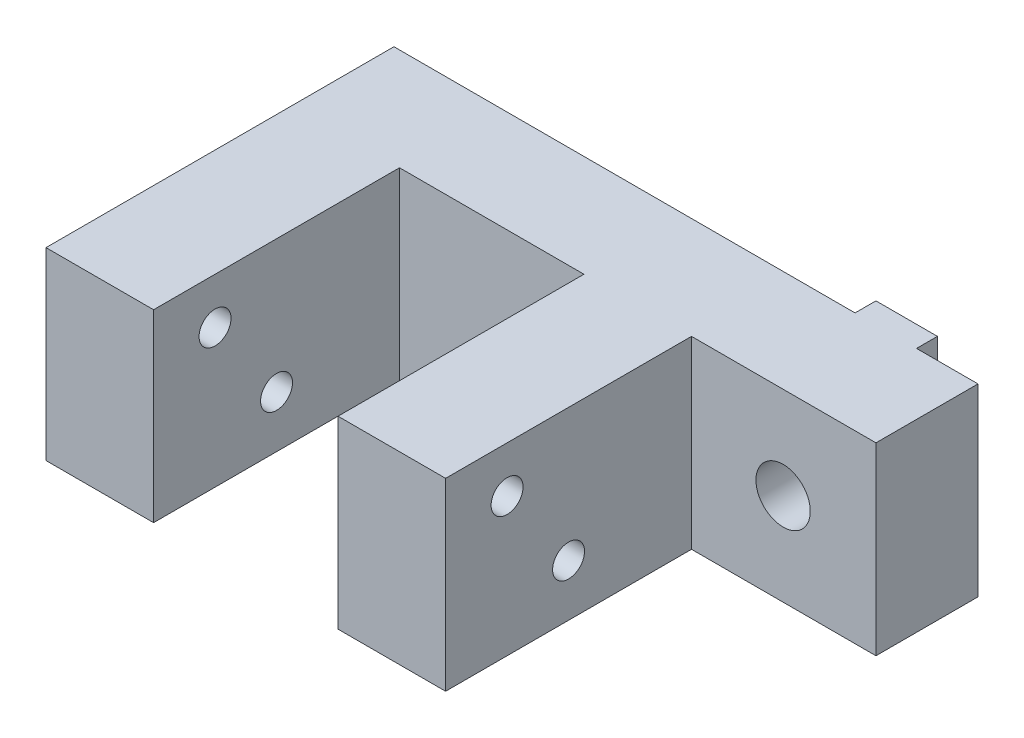
ISO-10303-21;
HEADER;
FILE_DESCRIPTION(('STEP AP214'),'2;1');
FILE_NAME('part.step','',(''),(''),'','','');
FILE_SCHEMA(('AUTOMOTIVE_DESIGN { 1 0 10303 214 1 1 1 1 }'));
ENDSEC;
DATA;
#1=APPLICATION_CONTEXT('core data for automotive mechanical design processes');
#2=APPLICATION_PROTOCOL_DEFINITION('international standard','automotive_design',2000,#1);
#3=PRODUCT_CONTEXT('',#1,'mechanical');
#4=PRODUCT('Part','Part','',(#3));
#5=PRODUCT_RELATED_PRODUCT_CATEGORY('part','',(#4));
#6=PRODUCT_DEFINITION_FORMATION('','',#4);
#7=PRODUCT_DEFINITION_CONTEXT('part definition',#1,'design');
#8=PRODUCT_DEFINITION('design','',#6,#7);
#9=PRODUCT_DEFINITION_SHAPE('','',#8);
#10=(LENGTH_UNIT() NAMED_UNIT(*) SI_UNIT(.MILLI.,.METRE.));
#11=(NAMED_UNIT(*) PLANE_ANGLE_UNIT() SI_UNIT($,.RADIAN.));
#12=(NAMED_UNIT(*) SI_UNIT($,.STERADIAN.) SOLID_ANGLE_UNIT());
#13=UNCERTAINTY_MEASURE_WITH_UNIT(LENGTH_MEASURE(1.E-05),#10,'distance_accuracy_value','');
#14=(GEOMETRIC_REPRESENTATION_CONTEXT(3) GLOBAL_UNCERTAINTY_ASSIGNED_CONTEXT((#13)) GLOBAL_UNIT_ASSIGNED_CONTEXT((#10,
#11,#12)) REPRESENTATION_CONTEXT('',''));
#15=CARTESIAN_POINT('',(0.,0.,0.));
#16=DIRECTION('',(0.,0.,1.));
#17=DIRECTION('',(1.,0.,0.));
#18=AXIS2_PLACEMENT_3D('',#15,#16,#17);
#19=CARTESIAN_POINT('',(41.275,9.525,12.7));
#20=DIRECTION('',(0.,0.,-1.));
#21=DIRECTION('',(-1.,0.,0.));
#22=AXIS2_PLACEMENT_3D('',#19,#20,#21);
#23=PLANE('',#22);
#24=CARTESIAN_POINT('',(50.7365,0.,12.7));
#25=DIRECTION('',(0.,0.,-1.));
#26=DIRECTION('',(-1.,0.,0.));
#27=AXIS2_PLACEMENT_3D('',#24,#25,#26);
#28=CIRCLE('',#27,2.80669999999999);
#29=CARTESIAN_POINT('',(47.9298,0.,12.7));
#30=VERTEX_POINT('',#29);
#31=EDGE_CURVE('E312',#30,#30,#28,.T.);
#32=ORIENTED_EDGE('',*,*,#31,.T.);
#33=EDGE_LOOP('',(#32));
#34=FACE_BOUND('',#33,.T.);
#35=DIRECTION('',(1.,0.,0.));
#36=VECTOR('',#35,1.);
#37=CARTESIAN_POINT('',(41.275,-9.525,12.7));
#38=LINE('',#37,#36);
#39=CARTESIAN_POINT('',(41.275,-9.525,12.7));
#40=VERTEX_POINT('',#39);
#41=CARTESIAN_POINT('',(60.325,-9.525,12.7));
#42=VERTEX_POINT('',#41);
#43=EDGE_CURVE('E138',#40,#42,#38,.T.);
#44=ORIENTED_EDGE('',*,*,#43,.T.);
#45=DIRECTION('',(0.,-1.,0.));
#46=VECTOR('',#45,1.);
#47=CARTESIAN_POINT('',(60.325,9.525,12.7));
#48=LINE('',#47,#46);
#49=CARTESIAN_POINT('',(60.325,9.525,12.7));
#50=VERTEX_POINT('',#49);
#51=EDGE_CURVE('E11',#50,#42,#48,.T.);
#52=ORIENTED_EDGE('',*,*,#51,.F.);
#53=DIRECTION('',(1.,0.,0.));
#54=VECTOR('',#53,1.);
#55=CARTESIAN_POINT('',(41.275,9.525,12.7));
#56=LINE('',#55,#54);
#57=CARTESIAN_POINT('',(41.275,9.525,12.7));
#58=VERTEX_POINT('',#57);
#59=EDGE_CURVE('E182',#58,#50,#56,.T.);
#60=ORIENTED_EDGE('',*,*,#59,.F.);
#61=DIRECTION('',(0.,-1.,0.));
#62=VECTOR('',#61,1.);
#63=CARTESIAN_POINT('',(41.275,9.525,12.7));
#64=LINE('',#63,#62);
#65=EDGE_CURVE('E151',#58,#40,#64,.T.);
#66=ORIENTED_EDGE('',*,*,#65,.T.);
#67=EDGE_LOOP('',(#44,#52,#60,#66));
#68=FACE_BOUND('',#67,.T.);
#69=ADVANCED_FACE('F34',(#34,#68),#23,.F.);
#70=CARTESIAN_POINT('',(60.325,9.525,12.7));
#71=DIRECTION('',(-1.,0.,0.));
#72=DIRECTION('',(0.,0.,1.));
#73=AXIS2_PLACEMENT_3D('',#70,#71,#72);
#74=PLANE('',#73);
#75=DIRECTION('',(0.,0.,-1.));
#76=VECTOR('',#75,1.);
#77=CARTESIAN_POINT('',(60.325,-9.525,12.7));
#78=LINE('',#77,#76);
#79=CARTESIAN_POINT('',(60.325,-9.525,2.159));
#80=VERTEX_POINT('',#79);
#81=EDGE_CURVE('E134',#42,#80,#78,.T.);
#82=ORIENTED_EDGE('',*,*,#81,.T.);
#83=DIRECTION('',(0.,-1.,0.));
#84=VECTOR('',#83,1.);
#85=CARTESIAN_POINT('',(60.325,9.525,2.159));
#86=LINE('',#85,#84);
#87=CARTESIAN_POINT('',(60.325,9.525,2.159));
#88=VERTEX_POINT('',#87);
#89=EDGE_CURVE('E41',#88,#80,#86,.T.);
#90=ORIENTED_EDGE('',*,*,#89,.F.);
#91=DIRECTION('',(0.,0.,-1.));
#92=VECTOR('',#91,1.);
#93=CARTESIAN_POINT('',(60.325,9.525,12.7));
#94=LINE('',#93,#92);
#95=EDGE_CURVE('E147',#50,#88,#94,.T.);
#96=ORIENTED_EDGE('',*,*,#95,.F.);
#97=ORIENTED_EDGE('',*,*,#51,.T.);
#98=EDGE_LOOP('',(#82,#90,#96,#97));
#99=FACE_BOUND('',#98,.T.);
#100=ADVANCED_FACE('F146',(#99),#74,.F.);
#101=CARTESIAN_POINT('',(53.975,9.525,2.159));
#102=DIRECTION('',(0.,0.,1.));
#103=DIRECTION('',(1.,0.,0.));
#104=AXIS2_PLACEMENT_3D('',#101,#102,#103);
#105=PLANE('',#104);
#106=DIRECTION('',(-1.,0.,0.));
#107=VECTOR('',#106,1.);
#108=CARTESIAN_POINT('',(53.975,-9.525,2.159));
#109=LINE('',#108,#107);
#110=CARTESIAN_POINT('',(53.975,-9.525,2.159));
#111=VERTEX_POINT('',#110);
#112=EDGE_CURVE('E140',#80,#111,#109,.T.);
#113=ORIENTED_EDGE('',*,*,#112,.T.);
#114=DIRECTION('',(0.,-1.,0.));
#115=VECTOR('',#114,1.);
#116=CARTESIAN_POINT('',(53.975,9.525,2.159));
#117=LINE('',#116,#115);
#118=CARTESIAN_POINT('',(53.975,9.525,2.159));
#119=VERTEX_POINT('',#118);
#120=EDGE_CURVE('E238',#119,#111,#117,.T.);
#121=ORIENTED_EDGE('',*,*,#120,.F.);
#122=DIRECTION('',(-1.,0.,0.));
#123=VECTOR('',#122,1.);
#124=CARTESIAN_POINT('',(53.975,9.525,2.159));
#125=LINE('',#124,#123);
#126=EDGE_CURVE('E185',#88,#119,#125,.T.);
#127=ORIENTED_EDGE('',*,*,#126,.F.);
#128=ORIENTED_EDGE('',*,*,#89,.T.);
#129=EDGE_LOOP('',(#113,#121,#127,#128));
#130=FACE_BOUND('',#129,.T.);
#131=ADVANCED_FACE('F242',(#130),#105,.F.);
#132=CARTESIAN_POINT('',(53.975,9.525,0.));
#133=DIRECTION('',(-1.,0.,0.));
#134=DIRECTION('',(0.,0.,1.));
#135=AXIS2_PLACEMENT_3D('',#132,#133,#134);
#136=PLANE('',#135);
#137=DIRECTION('',(0.,0.,-1.));
#138=VECTOR('',#137,1.);
#139=CARTESIAN_POINT('',(53.975,-9.525,0.));
#140=LINE('',#139,#138);
#141=CARTESIAN_POINT('',(53.975,-9.525,0.));
#142=VERTEX_POINT('',#141);
#143=EDGE_CURVE('E160',#111,#142,#140,.T.);
#144=ORIENTED_EDGE('',*,*,#143,.T.);
#145=DIRECTION('',(0.,-1.,0.));
#146=VECTOR('',#145,1.);
#147=CARTESIAN_POINT('',(53.975,9.525,0.));
#148=LINE('',#147,#146);
#149=CARTESIAN_POINT('',(53.975,9.525,0.));
#150=VERTEX_POINT('',#149);
#151=EDGE_CURVE('E235',#150,#142,#148,.T.);
#152=ORIENTED_EDGE('',*,*,#151,.F.);
#153=DIRECTION('',(0.,0.,-1.));
#154=VECTOR('',#153,1.);
#155=CARTESIAN_POINT('',(53.975,9.525,0.));
#156=LINE('',#155,#154);
#157=EDGE_CURVE('E187',#119,#150,#156,.T.);
#158=ORIENTED_EDGE('',*,*,#157,.F.);
#159=ORIENTED_EDGE('',*,*,#120,.T.);
#160=EDGE_LOOP('',(#144,#152,#158,#159));
#161=FACE_BOUND('',#160,.T.);
#162=ADVANCED_FACE('F250',(#161),#136,.F.);
#163=CARTESIAN_POINT('',(47.625,9.525,0.));
#164=DIRECTION('',(0.,0.,1.));
#165=DIRECTION('',(1.,0.,0.));
#166=AXIS2_PLACEMENT_3D('',#163,#164,#165);
#167=PLANE('',#166);
#168=CARTESIAN_POINT('',(50.7365,0.,0.));
#169=DIRECTION('',(0.,0.,-1.));
#170=DIRECTION('',(-1.,0.,0.));
#171=AXIS2_PLACEMENT_3D('',#168,#169,#170);
#172=CIRCLE('',#171,2.80669999999999);
#173=CARTESIAN_POINT('',(47.9298,0.,0.));
#174=VERTEX_POINT('',#173);
#175=EDGE_CURVE('E315',#174,#174,#172,.T.);
#176=ORIENTED_EDGE('',*,*,#175,.F.);
#177=EDGE_LOOP('',(#176));
#178=FACE_BOUND('',#177,.T.);
#179=DIRECTION('',(-1.,0.,0.));
#180=VECTOR('',#179,1.);
#181=CARTESIAN_POINT('',(47.625,-9.525,0.));
#182=LINE('',#181,#180);
#183=CARTESIAN_POINT('',(47.625,-9.525,0.));
#184=VERTEX_POINT('',#183);
#185=EDGE_CURVE('E162',#142,#184,#182,.T.);
#186=ORIENTED_EDGE('',*,*,#185,.T.);
#187=DIRECTION('',(0.,-1.,0.));
#188=VECTOR('',#187,1.);
#189=CARTESIAN_POINT('',(47.625,9.525,0.));
#190=LINE('',#189,#188);
#191=CARTESIAN_POINT('',(47.625,9.525,0.));
#192=VERTEX_POINT('',#191);
#193=EDGE_CURVE('E232',#192,#184,#190,.T.);
#194=ORIENTED_EDGE('',*,*,#193,.F.);
#195=DIRECTION('',(-1.,0.,0.));
#196=VECTOR('',#195,1.);
#197=CARTESIAN_POINT('',(47.625,9.525,0.));
#198=LINE('',#197,#196);
#199=EDGE_CURVE('E189',#150,#192,#198,.T.);
#200=ORIENTED_EDGE('',*,*,#199,.F.);
#201=ORIENTED_EDGE('',*,*,#151,.T.);
#202=EDGE_LOOP('',(#186,#194,#200,#201));
#203=FACE_BOUND('',#202,.T.);
#204=ADVANCED_FACE('F253',(#178,#203),#167,.F.);
#205=CARTESIAN_POINT('',(47.625,9.525,2.159));
#206=DIRECTION('',(1.,0.,0.));
#207=DIRECTION('',(0.,0.,-1.));
#208=AXIS2_PLACEMENT_3D('',#205,#206,#207);
#209=PLANE('',#208);
#210=DIRECTION('',(0.,0.,1.));
#211=VECTOR('',#210,1.);
#212=CARTESIAN_POINT('',(47.625,-9.525,2.159));
#213=LINE('',#212,#211);
#214=CARTESIAN_POINT('',(47.625,-9.525,2.159));
#215=VERTEX_POINT('',#214);
#216=EDGE_CURVE('E164',#184,#215,#213,.T.);
#217=ORIENTED_EDGE('',*,*,#216,.T.);
#218=DIRECTION('',(0.,-1.,0.));
#219=VECTOR('',#218,1.);
#220=CARTESIAN_POINT('',(47.625,9.525,2.159));
#221=LINE('',#220,#219);
#222=CARTESIAN_POINT('',(47.625,9.525,2.159));
#223=VERTEX_POINT('',#222);
#224=EDGE_CURVE('E229',#223,#215,#221,.T.);
#225=ORIENTED_EDGE('',*,*,#224,.F.);
#226=DIRECTION('',(0.,0.,1.));
#227=VECTOR('',#226,1.);
#228=CARTESIAN_POINT('',(47.625,9.525,2.159));
#229=LINE('',#228,#227);
#230=EDGE_CURVE('E191',#192,#223,#229,.T.);
#231=ORIENTED_EDGE('',*,*,#230,.F.);
#232=ORIENTED_EDGE('',*,*,#193,.T.);
#233=EDGE_LOOP('',(#217,#225,#231,#232));
#234=FACE_BOUND('',#233,.T.);
#235=ADVANCED_FACE('F258',(#234),#209,.F.);
#236=CARTESIAN_POINT('',(0.,9.525,2.159));
#237=DIRECTION('',(0.,0.,1.));
#238=DIRECTION('',(1.,0.,0.));
#239=AXIS2_PLACEMENT_3D('',#236,#237,#238);
#240=PLANE('',#239);
#241=DIRECTION('',(-1.,0.,0.));
#242=VECTOR('',#241,1.);
#243=CARTESIAN_POINT('',(0.,-9.525,2.159));
#244=LINE('',#243,#242);
#245=CARTESIAN_POINT('',(0.,-9.525,2.159));
#246=VERTEX_POINT('',#245);
#247=EDGE_CURVE('E166',#215,#246,#244,.T.);
#248=ORIENTED_EDGE('',*,*,#247,.T.);
#249=DIRECTION('',(0.,-1.,0.));
#250=VECTOR('',#249,1.);
#251=CARTESIAN_POINT('',(0.,9.525,2.159));
#252=LINE('',#251,#250);
#253=CARTESIAN_POINT('',(0.,9.525,2.159));
#254=VERTEX_POINT('',#253);
#255=EDGE_CURVE('E226',#254,#246,#252,.T.);
#256=ORIENTED_EDGE('',*,*,#255,.F.);
#257=DIRECTION('',(-1.,0.,0.));
#258=VECTOR('',#257,1.);
#259=CARTESIAN_POINT('',(0.,9.525,2.159));
#260=LINE('',#259,#258);
#261=EDGE_CURVE('E193',#223,#254,#260,.T.);
#262=ORIENTED_EDGE('',*,*,#261,.F.);
#263=ORIENTED_EDGE('',*,*,#224,.T.);
#264=EDGE_LOOP('',(#248,#256,#262,#263));
#265=FACE_BOUND('',#264,.T.);
#266=ADVANCED_FACE('F264',(#265),#240,.F.);
#267=CARTESIAN_POINT('',(0.,9.525,38.1));
#268=DIRECTION('',(1.,0.,0.));
#269=DIRECTION('',(0.,0.,-1.));
#270=AXIS2_PLACEMENT_3D('',#267,#268,#269);
#271=PLANE('',#270);
#272=CARTESIAN_POINT('',(0.,4.7625,31.75));
#273=DIRECTION('',(1.,0.,0.));
#274=DIRECTION('',(0.,0.,-1.));
#275=AXIS2_PLACEMENT_3D('',#272,#273,#274);
#276=CIRCLE('',#275,1.64999999999999);
#277=CARTESIAN_POINT('',(0.,4.7625,30.1));
#278=VERTEX_POINT('',#277);
#279=EDGE_CURVE('E314',#278,#278,#276,.T.);
#280=ORIENTED_EDGE('',*,*,#279,.T.);
#281=EDGE_LOOP('',(#280));
#282=FACE_BOUND('',#281,.T.);
#283=CARTESIAN_POINT('',(0.,-4.1783,25.4));
#284=DIRECTION('',(1.,0.,0.));
#285=DIRECTION('',(0.,0.,-1.));
#286=AXIS2_PLACEMENT_3D('',#283,#284,#285);
#287=CIRCLE('',#286,1.64999999999999);
#288=CARTESIAN_POINT('',(0.,-4.1783,23.75));
#289=VERTEX_POINT('',#288);
#290=EDGE_CURVE('E331',#289,#289,#287,.T.);
#291=ORIENTED_EDGE('',*,*,#290,.T.);
#292=EDGE_LOOP('',(#291));
#293=FACE_BOUND('',#292,.T.);
#294=DIRECTION('',(0.,0.,1.));
#295=VECTOR('',#294,1.);
#296=CARTESIAN_POINT('',(0.,-9.525,38.1));
#297=LINE('',#296,#295);
#298=CARTESIAN_POINT('',(0.,-9.525,38.1));
#299=VERTEX_POINT('',#298);
#300=EDGE_CURVE('E168',#246,#299,#297,.T.);
#301=ORIENTED_EDGE('',*,*,#300,.T.);
#302=DIRECTION('',(0.,-1.,0.));
#303=VECTOR('',#302,1.);
#304=CARTESIAN_POINT('',(0.,9.525,38.1));
#305=LINE('',#304,#303);
#306=CARTESIAN_POINT('',(0.,9.525,38.1));
#307=VERTEX_POINT('',#306);
#308=EDGE_CURVE('E223',#307,#299,#305,.T.);
#309=ORIENTED_EDGE('',*,*,#308,.F.);
#310=DIRECTION('',(0.,0.,1.));
#311=VECTOR('',#310,1.);
#312=CARTESIAN_POINT('',(0.,9.525,38.1));
#313=LINE('',#312,#311);
#314=EDGE_CURVE('E195',#254,#307,#313,.T.);
#315=ORIENTED_EDGE('',*,*,#314,.F.);
#316=ORIENTED_EDGE('',*,*,#255,.T.);
#317=EDGE_LOOP('',(#301,#309,#315,#316));
#318=FACE_BOUND('',#317,.T.);
#319=ADVANCED_FACE('F268',(#282,#293,#318),#271,.F.);
#320=CARTESIAN_POINT('',(11.1125,9.525,38.1));
#321=DIRECTION('',(0.,0.,-1.));
#322=DIRECTION('',(-1.,0.,0.));
#323=AXIS2_PLACEMENT_3D('',#320,#321,#322);
#324=PLANE('',#323);
#325=DIRECTION('',(1.,0.,0.));
#326=VECTOR('',#325,1.);
#327=CARTESIAN_POINT('',(11.1125,-9.525,38.1));
#328=LINE('',#327,#326);
#329=CARTESIAN_POINT('',(11.1125,-9.525,38.1));
#330=VERTEX_POINT('',#329);
#331=EDGE_CURVE('E170',#299,#330,#328,.T.);
#332=ORIENTED_EDGE('',*,*,#331,.T.);
#333=DIRECTION('',(0.,-1.,0.));
#334=VECTOR('',#333,1.);
#335=CARTESIAN_POINT('',(11.1125,9.525,38.1));
#336=LINE('',#335,#334);
#337=CARTESIAN_POINT('',(11.1125,9.525,38.1));
#338=VERTEX_POINT('',#337);
#339=EDGE_CURVE('E220',#338,#330,#336,.T.);
#340=ORIENTED_EDGE('',*,*,#339,.F.);
#341=DIRECTION('',(1.,0.,0.));
#342=VECTOR('',#341,1.);
#343=CARTESIAN_POINT('',(11.1125,9.525,38.1));
#344=LINE('',#343,#342);
#345=EDGE_CURVE('E197',#307,#338,#344,.T.);
#346=ORIENTED_EDGE('',*,*,#345,.F.);
#347=ORIENTED_EDGE('',*,*,#308,.T.);
#348=EDGE_LOOP('',(#332,#340,#346,#347));
#349=FACE_BOUND('',#348,.T.);
#350=ADVANCED_FACE('F273',(#349),#324,.F.);
#351=CARTESIAN_POINT('',(11.1125,9.525,12.7));
#352=DIRECTION('',(-1.,0.,0.));
#353=DIRECTION('',(0.,0.,1.));
#354=AXIS2_PLACEMENT_3D('',#351,#352,#353);
#355=PLANE('',#354);
#356=CARTESIAN_POINT('',(11.1125,4.7625,31.75));
#357=DIRECTION('',(-1.,0.,0.));
#358=DIRECTION('',(0.,0.,1.));
#359=AXIS2_PLACEMENT_3D('',#356,#357,#358);
#360=CIRCLE('',#359,1.64999999999999);
#361=CARTESIAN_POINT('',(11.1125,4.7625,33.4));
#362=VERTEX_POINT('',#361);
#363=EDGE_CURVE('E328',#362,#362,#360,.T.);
#364=ORIENTED_EDGE('',*,*,#363,.T.);
#365=EDGE_LOOP('',(#364));
#366=FACE_BOUND('',#365,.T.);
#367=CARTESIAN_POINT('',(11.1125,-4.1783,25.4));
#368=DIRECTION('',(-1.,0.,0.));
#369=DIRECTION('',(0.,0.,1.));
#370=AXIS2_PLACEMENT_3D('',#367,#368,#369);
#371=CIRCLE('',#370,1.64999999999999);
#372=CARTESIAN_POINT('',(11.1125,-4.1783,27.05));
#373=VERTEX_POINT('',#372);
#374=EDGE_CURVE('E155',#373,#373,#371,.T.);
#375=ORIENTED_EDGE('',*,*,#374,.T.);
#376=EDGE_LOOP('',(#375));
#377=FACE_BOUND('',#376,.T.);
#378=DIRECTION('',(0.,0.,-1.));
#379=VECTOR('',#378,1.);
#380=CARTESIAN_POINT('',(11.1125,-9.525,12.7));
#381=LINE('',#380,#379);
#382=CARTESIAN_POINT('',(11.1125,-9.525,12.7));
#383=VERTEX_POINT('',#382);
#384=EDGE_CURVE('E172',#330,#383,#381,.T.);
#385=ORIENTED_EDGE('',*,*,#384,.T.);
#386=DIRECTION('',(0.,-1.,0.));
#387=VECTOR('',#386,1.);
#388=CARTESIAN_POINT('',(11.1125,9.525,12.7));
#389=LINE('',#388,#387);
#390=CARTESIAN_POINT('',(11.1125,9.525,12.7));
#391=VERTEX_POINT('',#390);
#392=EDGE_CURVE('E217',#391,#383,#389,.T.);
#393=ORIENTED_EDGE('',*,*,#392,.F.);
#394=DIRECTION('',(0.,0.,-1.));
#395=VECTOR('',#394,1.);
#396=CARTESIAN_POINT('',(11.1125,9.525,12.7));
#397=LINE('',#396,#395);
#398=EDGE_CURVE('E199',#338,#391,#397,.T.);
#399=ORIENTED_EDGE('',*,*,#398,.F.);
#400=ORIENTED_EDGE('',*,*,#339,.T.);
#401=EDGE_LOOP('',(#385,#393,#399,#400));
#402=FACE_BOUND('',#401,.T.);
#403=ADVANCED_FACE('F279',(#366,#377,#402),#355,.F.);
#404=CARTESIAN_POINT('',(30.1625,9.525,12.7));
#405=DIRECTION('',(0.,0.,-1.));
#406=DIRECTION('',(-1.,0.,0.));
#407=AXIS2_PLACEMENT_3D('',#404,#405,#406);
#408=PLANE('',#407);
#409=DIRECTION('',(1.,0.,0.));
#410=VECTOR('',#409,1.);
#411=CARTESIAN_POINT('',(30.1625,-9.525,12.7));
#412=LINE('',#411,#410);
#413=CARTESIAN_POINT('',(30.1625,-9.525,12.7));
#414=VERTEX_POINT('',#413);
#415=EDGE_CURVE('E174',#383,#414,#412,.T.);
#416=ORIENTED_EDGE('',*,*,#415,.T.);
#417=DIRECTION('',(0.,-1.,0.));
#418=VECTOR('',#417,1.);
#419=CARTESIAN_POINT('',(30.1625,9.525,12.7));
#420=LINE('',#419,#418);
#421=CARTESIAN_POINT('',(30.1625,9.525,12.7));
#422=VERTEX_POINT('',#421);
#423=EDGE_CURVE('E214',#422,#414,#420,.T.);
#424=ORIENTED_EDGE('',*,*,#423,.F.);
#425=DIRECTION('',(1.,0.,0.));
#426=VECTOR('',#425,1.);
#427=CARTESIAN_POINT('',(30.1625,9.525,12.7));
#428=LINE('',#427,#426);
#429=EDGE_CURVE('E201',#391,#422,#428,.T.);
#430=ORIENTED_EDGE('',*,*,#429,.F.);
#431=ORIENTED_EDGE('',*,*,#392,.T.);
#432=EDGE_LOOP('',(#416,#424,#430,#431));
#433=FACE_BOUND('',#432,.T.);
#434=ADVANCED_FACE('F283',(#433),#408,.F.);
#435=CARTESIAN_POINT('',(30.1625,9.525,38.1));
#436=DIRECTION('',(1.,0.,0.));
#437=DIRECTION('',(0.,0.,-1.));
#438=AXIS2_PLACEMENT_3D('',#435,#436,#437);
#439=PLANE('',#438);
#440=CARTESIAN_POINT('',(30.1625,4.7625,31.75));
#441=DIRECTION('',(1.,0.,0.));
#442=DIRECTION('',(0.,0.,-1.));
#443=AXIS2_PLACEMENT_3D('',#440,#441,#442);
#444=CIRCLE('',#443,1.64999999999999);
#445=CARTESIAN_POINT('',(30.1625,4.7625,30.1));
#446=VERTEX_POINT('',#445);
#447=EDGE_CURVE('E325',#446,#446,#444,.T.);
#448=ORIENTED_EDGE('',*,*,#447,.T.);
#449=EDGE_LOOP('',(#448));
#450=FACE_BOUND('',#449,.T.);
#451=CARTESIAN_POINT('',(30.1625,-4.1783,25.4));
#452=DIRECTION('',(1.,0.,0.));
#453=DIRECTION('',(0.,0.,-1.));
#454=AXIS2_PLACEMENT_3D('',#451,#452,#453);
#455=CIRCLE('',#454,1.64999999999999);
#456=CARTESIAN_POINT('',(30.1625,-4.1783,23.75));
#457=VERTEX_POINT('',#456);
#458=EDGE_CURVE('E152',#457,#457,#455,.T.);
#459=ORIENTED_EDGE('',*,*,#458,.T.);
#460=EDGE_LOOP('',(#459));
#461=FACE_BOUND('',#460,.T.);
#462=DIRECTION('',(0.,0.,1.));
#463=VECTOR('',#462,1.);
#464=CARTESIAN_POINT('',(30.1625,-9.525,38.1));
#465=LINE('',#464,#463);
#466=CARTESIAN_POINT('',(30.1625,-9.525,38.1));
#467=VERTEX_POINT('',#466);
#468=EDGE_CURVE('E176',#414,#467,#465,.T.);
#469=ORIENTED_EDGE('',*,*,#468,.T.);
#470=DIRECTION('',(0.,-1.,0.));
#471=VECTOR('',#470,1.);
#472=CARTESIAN_POINT('',(30.1625,9.525,38.1));
#473=LINE('',#472,#471);
#474=CARTESIAN_POINT('',(30.1625,9.525,38.1));
#475=VERTEX_POINT('',#474);
#476=EDGE_CURVE('E211',#475,#467,#473,.T.);
#477=ORIENTED_EDGE('',*,*,#476,.F.);
#478=DIRECTION('',(0.,0.,1.));
#479=VECTOR('',#478,1.);
#480=CARTESIAN_POINT('',(30.1625,9.525,38.1));
#481=LINE('',#480,#479);
#482=EDGE_CURVE('E203',#422,#475,#481,.T.);
#483=ORIENTED_EDGE('',*,*,#482,.F.);
#484=ORIENTED_EDGE('',*,*,#423,.T.);
#485=EDGE_LOOP('',(#469,#477,#483,#484));
#486=FACE_BOUND('',#485,.T.);
#487=ADVANCED_FACE('F288',(#450,#461,#486),#439,.F.);
#488=CARTESIAN_POINT('',(41.275,9.525,38.1));
#489=DIRECTION('',(0.,0.,-1.));
#490=DIRECTION('',(-1.,0.,0.));
#491=AXIS2_PLACEMENT_3D('',#488,#489,#490);
#492=PLANE('',#491);
#493=DIRECTION('',(1.,0.,0.));
#494=VECTOR('',#493,1.);
#495=CARTESIAN_POINT('',(41.275,-9.525,38.1));
#496=LINE('',#495,#494);
#497=CARTESIAN_POINT('',(41.275,-9.525,38.1));
#498=VERTEX_POINT('',#497);
#499=EDGE_CURVE('E178',#467,#498,#496,.T.);
#500=ORIENTED_EDGE('',*,*,#499,.T.);
#501=DIRECTION('',(0.,-1.,0.));
#502=VECTOR('',#501,1.);
#503=CARTESIAN_POINT('',(41.275,9.525,38.1));
#504=LINE('',#503,#502);
#505=CARTESIAN_POINT('',(41.275,9.525,38.1));
#506=VERTEX_POINT('',#505);
#507=EDGE_CURVE('E208',#506,#498,#504,.T.);
#508=ORIENTED_EDGE('',*,*,#507,.F.);
#509=DIRECTION('',(1.,0.,0.));
#510=VECTOR('',#509,1.);
#511=CARTESIAN_POINT('',(41.275,9.525,38.1));
#512=LINE('',#511,#510);
#513=EDGE_CURVE('E53',#475,#506,#512,.T.);
#514=ORIENTED_EDGE('',*,*,#513,.F.);
#515=ORIENTED_EDGE('',*,*,#476,.T.);
#516=EDGE_LOOP('',(#500,#508,#514,#515));
#517=FACE_BOUND('',#516,.T.);
#518=ADVANCED_FACE('F291',(#517),#492,.F.);
#519=CARTESIAN_POINT('',(41.275,9.525,12.7));
#520=DIRECTION('',(-1.,0.,0.));
#521=DIRECTION('',(0.,0.,1.));
#522=AXIS2_PLACEMENT_3D('',#519,#520,#521);
#523=PLANE('',#522);
#524=CARTESIAN_POINT('',(41.275,4.7625,31.75));
#525=DIRECTION('',(1.,0.,0.));
#526=DIRECTION('',(0.,0.,-1.));
#527=AXIS2_PLACEMENT_3D('',#524,#525,#526);
#528=CIRCLE('',#527,1.64999999999999);
#529=CARTESIAN_POINT('',(41.275,4.7625,30.1));
#530=VERTEX_POINT('',#529);
#531=EDGE_CURVE('E318',#530,#530,#528,.T.);
#532=ORIENTED_EDGE('',*,*,#531,.F.);
#533=EDGE_LOOP('',(#532));
#534=FACE_BOUND('',#533,.T.);
#535=CARTESIAN_POINT('',(41.275,-4.1783,25.4));
#536=DIRECTION('',(1.,0.,0.));
#537=DIRECTION('',(0.,0.,-1.));
#538=AXIS2_PLACEMENT_3D('',#535,#536,#537);
#539=CIRCLE('',#538,1.64999999999999);
#540=CARTESIAN_POINT('',(41.275,-4.1783,23.75));
#541=VERTEX_POINT('',#540);
#542=EDGE_CURVE('E334',#541,#541,#539,.T.);
#543=ORIENTED_EDGE('',*,*,#542,.F.);
#544=EDGE_LOOP('',(#543));
#545=FACE_BOUND('',#544,.T.);
#546=DIRECTION('',(0.,0.,-1.));
#547=VECTOR('',#546,1.);
#548=CARTESIAN_POINT('',(41.275,-9.525,12.7));
#549=LINE('',#548,#547);
#550=EDGE_CURVE('E180',#498,#40,#549,.T.);
#551=ORIENTED_EDGE('',*,*,#550,.T.);
#552=ORIENTED_EDGE('',*,*,#65,.F.);
#553=DIRECTION('',(0.,0.,-1.));
#554=VECTOR('',#553,1.);
#555=CARTESIAN_POINT('',(41.275,9.525,12.7));
#556=LINE('',#555,#554);
#557=EDGE_CURVE('E48',#506,#58,#556,.T.);
#558=ORIENTED_EDGE('',*,*,#557,.F.);
#559=ORIENTED_EDGE('',*,*,#507,.T.);
#560=EDGE_LOOP('',(#551,#552,#558,#559));
#561=FACE_BOUND('',#560,.T.);
#562=ADVANCED_FACE('F293',(#534,#545,#561),#523,.F.);
#563=CARTESIAN_POINT('',(60.325,9.525,12.7));
#564=DIRECTION('',(0.,1.,0.));
#565=DIRECTION('',(0.,0.,1.));
#566=AXIS2_PLACEMENT_3D('',#563,#564,#565);
#567=PLANE('',#566);
#568=ORIENTED_EDGE('',*,*,#59,.T.);
#569=ORIENTED_EDGE('',*,*,#95,.T.);
#570=ORIENTED_EDGE('',*,*,#126,.T.);
#571=ORIENTED_EDGE('',*,*,#157,.T.);
#572=ORIENTED_EDGE('',*,*,#199,.T.);
#573=ORIENTED_EDGE('',*,*,#230,.T.);
#574=ORIENTED_EDGE('',*,*,#261,.T.);
#575=ORIENTED_EDGE('',*,*,#314,.T.);
#576=ORIENTED_EDGE('',*,*,#345,.T.);
#577=ORIENTED_EDGE('',*,*,#398,.T.);
#578=ORIENTED_EDGE('',*,*,#429,.T.);
#579=ORIENTED_EDGE('',*,*,#482,.T.);
#580=ORIENTED_EDGE('',*,*,#513,.T.);
#581=ORIENTED_EDGE('',*,*,#557,.T.);
#582=EDGE_LOOP('',(#568,#569,#570,#571,#572,#573,#574,#575,#576,#577,#578,#579,#580,#581));
#583=FACE_BOUND('',#582,.T.);
#584=ADVANCED_FACE('F245',(#583),#567,.T.);
#585=CARTESIAN_POINT('',(60.325,-9.525,12.7));
#586=DIRECTION('',(0.,1.,0.));
#587=DIRECTION('',(0.,0.,1.));
#588=AXIS2_PLACEMENT_3D('',#585,#586,#587);
#589=PLANE('',#588);
#590=ORIENTED_EDGE('',*,*,#43,.F.);
#591=ORIENTED_EDGE('',*,*,#550,.F.);
#592=ORIENTED_EDGE('',*,*,#499,.F.);
#593=ORIENTED_EDGE('',*,*,#468,.F.);
#594=ORIENTED_EDGE('',*,*,#415,.F.);
#595=ORIENTED_EDGE('',*,*,#384,.F.);
#596=ORIENTED_EDGE('',*,*,#331,.F.);
#597=ORIENTED_EDGE('',*,*,#300,.F.);
#598=ORIENTED_EDGE('',*,*,#247,.F.);
#599=ORIENTED_EDGE('',*,*,#216,.F.);
#600=ORIENTED_EDGE('',*,*,#185,.F.);
#601=ORIENTED_EDGE('',*,*,#143,.F.);
#602=ORIENTED_EDGE('',*,*,#112,.F.);
#603=ORIENTED_EDGE('',*,*,#81,.F.);
#604=EDGE_LOOP('',(#590,#591,#592,#593,#594,#595,#596,#597,#598,#599,#600,#601,#602,#603));
#605=FACE_BOUND('',#604,.T.);
#606=ADVANCED_FACE('F135',(#605),#589,.F.);
#607=CARTESIAN_POINT('',(41.275,-4.1783,25.4));
#608=DIRECTION('',(1.,0.,0.));
#609=DIRECTION('',(0.,0.,-1.));
#610=AXIS2_PLACEMENT_3D('',#607,#608,#609);
#611=CYLINDRICAL_SURFACE('',#610,1.64999999999999);
#612=ORIENTED_EDGE('',*,*,#542,.T.);
#613=EDGE_LOOP('',(#612));
#614=FACE_BOUND('',#613,.T.);
#615=ORIENTED_EDGE('',*,*,#458,.F.);
#616=EDGE_LOOP('',(#615));
#617=FACE_BOUND('',#616,.T.);
#618=ADVANCED_FACE('F343',(#614,#617),#611,.F.);
#619=ORIENTED_EDGE('',*,*,#290,.F.);
#620=EDGE_LOOP('',(#619));
#621=FACE_BOUND('',#620,.T.);
#622=ORIENTED_EDGE('',*,*,#374,.F.);
#623=EDGE_LOOP('',(#622));
#624=FACE_BOUND('',#623,.T.);
#625=ADVANCED_FACE('F340',(#621,#624),#611,.F.);
#626=CARTESIAN_POINT('',(41.275,4.7625,31.75));
#627=DIRECTION('',(1.,0.,0.));
#628=DIRECTION('',(0.,0.,-1.));
#629=AXIS2_PLACEMENT_3D('',#626,#627,#628);
#630=CYLINDRICAL_SURFACE('',#629,1.64999999999999);
#631=ORIENTED_EDGE('',*,*,#531,.T.);
#632=EDGE_LOOP('',(#631));
#633=FACE_BOUND('',#632,.T.);
#634=ORIENTED_EDGE('',*,*,#447,.F.);
#635=EDGE_LOOP('',(#634));
#636=FACE_BOUND('',#635,.T.);
#637=ADVANCED_FACE('F342',(#633,#636),#630,.F.);
#638=ORIENTED_EDGE('',*,*,#279,.F.);
#639=EDGE_LOOP('',(#638));
#640=FACE_BOUND('',#639,.T.);
#641=ORIENTED_EDGE('',*,*,#363,.F.);
#642=EDGE_LOOP('',(#641));
#643=FACE_BOUND('',#642,.T.);
#644=ADVANCED_FACE('F350',(#640,#643),#630,.F.);
#645=CARTESIAN_POINT('',(50.7365,0.,0.));
#646=DIRECTION('',(0.,0.,-1.));
#647=DIRECTION('',(-1.,0.,0.));
#648=AXIS2_PLACEMENT_3D('',#645,#646,#647);
#649=CYLINDRICAL_SURFACE('',#648,2.80669999999999);
#650=ORIENTED_EDGE('',*,*,#31,.F.);
#651=EDGE_LOOP('',(#650));
#652=FACE_BOUND('',#651,.T.);
#653=ORIENTED_EDGE('',*,*,#175,.T.);
#654=EDGE_LOOP('',(#653));
#655=FACE_BOUND('',#654,.T.);
#656=ADVANCED_FACE('F385',(#652,#655),#649,.F.);
#657=CLOSED_SHELL('',(#69,#100,#131,#162,#204,#235,#266,#319,#350,#403,#434,#487,#518,#562,#584,
#606,#618,#625,#637,#644,#656));
#658=MANIFOLD_SOLID_BREP('B2',#657);
#659=ADVANCED_BREP_SHAPE_REPRESENTATION('',(#18,#658),#14);
#660=SHAPE_DEFINITION_REPRESENTATION(#9,#659);
ENDSEC;
END-ISO-10303-21;
